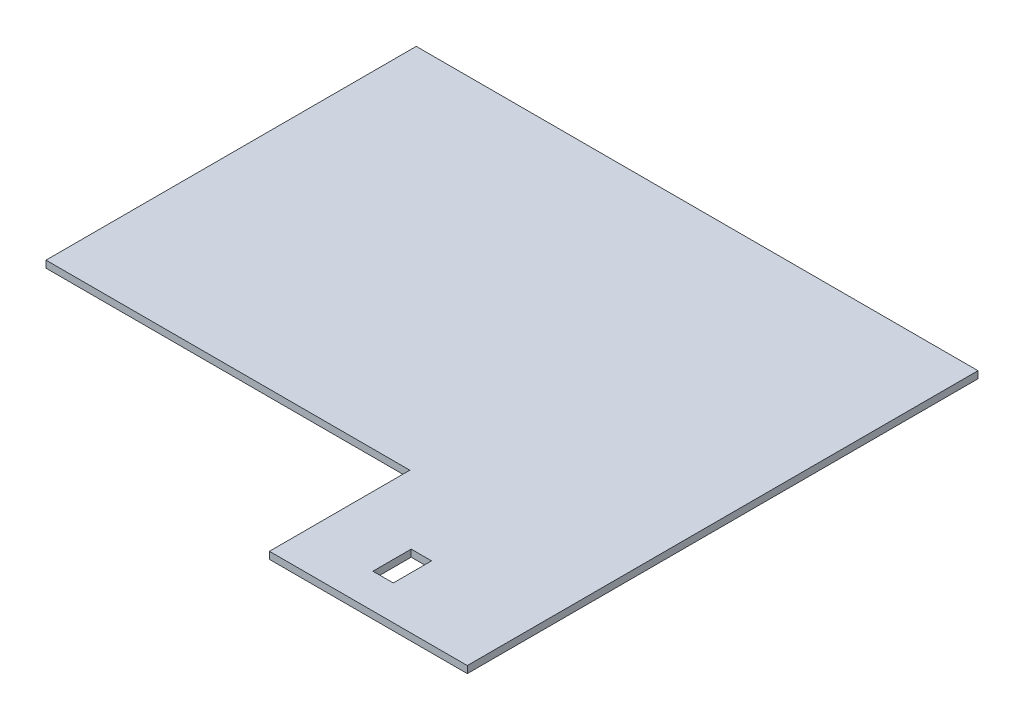
ISO-10303-21;
HEADER;
FILE_DESCRIPTION(('STEP AP214'),'2;1');
FILE_NAME('part.step','',(''),(''),'','','');
FILE_SCHEMA(('AUTOMOTIVE_DESIGN { 1 0 10303 214 1 1 1 1 }'));
ENDSEC;
DATA;
#1=APPLICATION_CONTEXT('core data for automotive mechanical design processes');
#2=APPLICATION_PROTOCOL_DEFINITION('international standard','automotive_design',2000,#1);
#3=PRODUCT_CONTEXT('',#1,'mechanical');
#4=PRODUCT('Part','Part','',(#3));
#5=PRODUCT_RELATED_PRODUCT_CATEGORY('part','',(#4));
#6=PRODUCT_DEFINITION_FORMATION('','',#4);
#7=PRODUCT_DEFINITION_CONTEXT('part definition',#1,'design');
#8=PRODUCT_DEFINITION('design','',#6,#7);
#9=PRODUCT_DEFINITION_SHAPE('','',#8);
#10=(LENGTH_UNIT() NAMED_UNIT(*) SI_UNIT(.MILLI.,.METRE.));
#11=(NAMED_UNIT(*) PLANE_ANGLE_UNIT() SI_UNIT($,.RADIAN.));
#12=(NAMED_UNIT(*) SI_UNIT($,.STERADIAN.) SOLID_ANGLE_UNIT());
#13=UNCERTAINTY_MEASURE_WITH_UNIT(LENGTH_MEASURE(1.E-05),#10,'distance_accuracy_value','');
#14=(GEOMETRIC_REPRESENTATION_CONTEXT(3) GLOBAL_UNCERTAINTY_ASSIGNED_CONTEXT((#13)) GLOBAL_UNIT_ASSIGNED_CONTEXT((#10,
#11,#12)) REPRESENTATION_CONTEXT('',''));
#15=CARTESIAN_POINT('',(0.,0.,0.));
#16=DIRECTION('',(0.,0.,1.));
#17=DIRECTION('',(1.,0.,0.));
#18=AXIS2_PLACEMENT_3D('',#15,#16,#17);
#19=CARTESIAN_POINT('',(127.62527392326,5.5,0.));
#20=DIRECTION('',(-1.,0.,0.));
#21=DIRECTION('',(0.,0.,1.));
#22=AXIS2_PLACEMENT_3D('',#19,#20,#21);
#23=PLANE('',#22);
#24=DIRECTION('',(0.,0.,-1.));
#25=VECTOR('',#24,1.);
#26=CARTESIAN_POINT('',(127.62527392326,0.,0.));
#27=LINE('',#26,#25);
#28=CARTESIAN_POINT('',(127.62527392326,0.,375.295789036028));
#29=VERTEX_POINT('',#28);
#30=CARTESIAN_POINT('',(127.62527392326,0.,345.295789036028));
#31=VERTEX_POINT('',#30);
#32=EDGE_CURVE('E156',#29,#31,#27,.T.);
#33=ORIENTED_EDGE('',*,*,#32,.T.);
#34=DIRECTION('',(0.,-1.,0.));
#35=VECTOR('',#34,1.);
#36=CARTESIAN_POINT('',(127.62527392326,5.5,345.295789036028));
#37=LINE('',#36,#35);
#38=CARTESIAN_POINT('',(127.62527392326,5.5,345.295789036028));
#39=VERTEX_POINT('',#38);
#40=EDGE_CURVE('E11',#39,#31,#37,.T.);
#41=ORIENTED_EDGE('',*,*,#40,.F.);
#42=DIRECTION('',(0.,0.,-1.));
#43=VECTOR('',#42,1.);
#44=CARTESIAN_POINT('',(127.62527392326,5.5,0.));
#45=LINE('',#44,#43);
#46=CARTESIAN_POINT('',(127.62527392326,5.5,375.295789036028));
#47=VERTEX_POINT('',#46);
#48=EDGE_CURVE('E126',#47,#39,#45,.T.);
#49=ORIENTED_EDGE('',*,*,#48,.F.);
#50=DIRECTION('',(0.,-1.,0.));
#51=VECTOR('',#50,1.);
#52=CARTESIAN_POINT('',(127.62527392326,5.5,375.295789036028));
#53=LINE('',#52,#51);
#54=EDGE_CURVE('E163',#47,#29,#53,.T.);
#55=ORIENTED_EDGE('',*,*,#54,.T.);
#56=EDGE_LOOP('',(#33,#41,#49,#55));
#57=FACE_BOUND('',#56,.T.);
#58=ADVANCED_FACE('F33',(#57),#23,.F.);
#59=CARTESIAN_POINT('',(0.,5.5,345.295789036028));
#60=DIRECTION('',(0.,0.,-1.));
#61=DIRECTION('',(-1.,0.,0.));
#62=AXIS2_PLACEMENT_3D('',#59,#60,#61);
#63=PLANE('',#62);
#64=DIRECTION('',(1.,0.,0.));
#65=VECTOR('',#64,1.);
#66=CARTESIAN_POINT('',(0.,0.,345.295789036028));
#67=LINE('',#66,#65);
#68=CARTESIAN_POINT('',(143.58670680185,0.,345.295789036028));
#69=VERTEX_POINT('',#68);
#70=EDGE_CURVE('E131',#31,#69,#67,.T.);
#71=ORIENTED_EDGE('',*,*,#70,.T.);
#72=DIRECTION('',(0.,-1.,0.));
#73=VECTOR('',#72,1.);
#74=CARTESIAN_POINT('',(143.58670680185,5.5,345.295789036028));
#75=LINE('',#74,#73);
#76=CARTESIAN_POINT('',(143.58670680185,5.5,345.295789036028));
#77=VERTEX_POINT('',#76);
#78=EDGE_CURVE('E43',#77,#69,#75,.T.);
#79=ORIENTED_EDGE('',*,*,#78,.F.);
#80=DIRECTION('',(1.,0.,0.));
#81=VECTOR('',#80,1.);
#82=CARTESIAN_POINT('',(0.,5.5,345.295789036028));
#83=LINE('',#82,#81);
#84=EDGE_CURVE('E120',#39,#77,#83,.T.);
#85=ORIENTED_EDGE('',*,*,#84,.F.);
#86=ORIENTED_EDGE('',*,*,#40,.T.);
#87=EDGE_LOOP('',(#71,#79,#85,#86));
#88=FACE_BOUND('',#87,.T.);
#89=ADVANCED_FACE('F130',(#88),#63,.F.);
#90=CARTESIAN_POINT('',(143.58670680185,5.5,0.));
#91=DIRECTION('',(1.,0.,0.));
#92=DIRECTION('',(0.,0.,-1.));
#93=AXIS2_PLACEMENT_3D('',#90,#91,#92);
#94=PLANE('',#93);
#95=DIRECTION('',(0.,0.,1.));
#96=VECTOR('',#95,1.);
#97=CARTESIAN_POINT('',(143.58670680185,0.,0.));
#98=LINE('',#97,#96);
#99=CARTESIAN_POINT('',(143.58670680185,0.,375.295789036028));
#100=VERTEX_POINT('',#99);
#101=EDGE_CURVE('E87',#69,#100,#98,.T.);
#102=ORIENTED_EDGE('',*,*,#101,.T.);
#103=DIRECTION('',(0.,-1.,0.));
#104=VECTOR('',#103,1.);
#105=CARTESIAN_POINT('',(143.58670680185,5.5,375.295789036028));
#106=LINE('',#105,#104);
#107=CARTESIAN_POINT('',(143.58670680185,5.5,375.295789036028));
#108=VERTEX_POINT('',#107);
#109=EDGE_CURVE('E132',#108,#100,#106,.T.);
#110=ORIENTED_EDGE('',*,*,#109,.F.);
#111=DIRECTION('',(0.,0.,1.));
#112=VECTOR('',#111,1.);
#113=CARTESIAN_POINT('',(143.58670680185,5.5,0.));
#114=LINE('',#113,#112);
#115=EDGE_CURVE('E124',#77,#108,#114,.T.);
#116=ORIENTED_EDGE('',*,*,#115,.F.);
#117=ORIENTED_EDGE('',*,*,#78,.T.);
#118=EDGE_LOOP('',(#102,#110,#116,#117));
#119=FACE_BOUND('',#118,.T.);
#120=ADVANCED_FACE('F134',(#119),#94,.F.);
#121=CARTESIAN_POINT('',(73.5867068018496,5.5,0.));
#122=DIRECTION('',(-1.,0.,0.));
#123=DIRECTION('',(0.,0.,1.));
#124=AXIS2_PLACEMENT_3D('',#121,#122,#123);
#125=PLANE('',#124);
#126=DIRECTION('',(0.,0.,-1.));
#127=VECTOR('',#126,1.);
#128=CARTESIAN_POINT('',(73.5867068018496,0.,0.));
#129=LINE('',#128,#127);
#130=CARTESIAN_POINT('',(73.5867068018496,0.,402.295789036028));
#131=VERTEX_POINT('',#130);
#132=CARTESIAN_POINT('',(73.5867068018496,0.,292.295789036028));
#133=VERTEX_POINT('',#132);
#134=EDGE_CURVE('E140',#131,#133,#129,.T.);
#135=ORIENTED_EDGE('',*,*,#134,.F.);
#136=DIRECTION('',(0.,-1.,0.));
#137=VECTOR('',#136,1.);
#138=CARTESIAN_POINT('',(73.5867068018496,5.5,402.295789036028));
#139=LINE('',#138,#137);
#140=CARTESIAN_POINT('',(73.5867068018496,5.5,402.295789036028));
#141=VERTEX_POINT('',#140);
#142=EDGE_CURVE('E37',#141,#131,#139,.T.);
#143=ORIENTED_EDGE('',*,*,#142,.F.);
#144=DIRECTION('',(0.,0.,-1.));
#145=VECTOR('',#144,1.);
#146=CARTESIAN_POINT('',(73.5867068018496,5.5,0.));
#147=LINE('',#146,#145);
#148=CARTESIAN_POINT('',(73.5867068018496,5.5,292.295789036028));
#149=VERTEX_POINT('',#148);
#150=EDGE_CURVE('E162',#141,#149,#147,.T.);
#151=ORIENTED_EDGE('',*,*,#150,.T.);
#152=DIRECTION('',(0.,-1.,0.));
#153=VECTOR('',#152,1.);
#154=CARTESIAN_POINT('',(73.5867068018496,5.5,292.295789036028));
#155=LINE('',#154,#153);
#156=EDGE_CURVE('E136',#149,#133,#155,.T.);
#157=ORIENTED_EDGE('',*,*,#156,.T.);
#158=EDGE_LOOP('',(#135,#143,#151,#157));
#159=FACE_BOUND('',#158,.T.);
#160=ADVANCED_FACE('F35',(#159),#125,.T.);
#161=CARTESIAN_POINT('',(0.,5.5,402.295789036028));
#162=DIRECTION('',(0.,0.,1.));
#163=DIRECTION('',(1.,0.,0.));
#164=AXIS2_PLACEMENT_3D('',#161,#162,#163);
#165=PLANE('',#164);
#166=DIRECTION('',(-1.,0.,0.));
#167=VECTOR('',#166,1.);
#168=CARTESIAN_POINT('',(0.,0.,402.295789036028));
#169=LINE('',#168,#167);
#170=CARTESIAN_POINT('',(228.58670680185,0.,402.295789036028));
#171=VERTEX_POINT('',#170);
#172=EDGE_CURVE('E143',#171,#131,#169,.T.);
#173=ORIENTED_EDGE('',*,*,#172,.F.);
#174=DIRECTION('',(0.,-1.,0.));
#175=VECTOR('',#174,1.);
#176=CARTESIAN_POINT('',(228.58670680185,5.5,402.295789036028));
#177=LINE('',#176,#175);
#178=CARTESIAN_POINT('',(228.58670680185,5.5,402.295789036028));
#179=VERTEX_POINT('',#178);
#180=EDGE_CURVE('E174',#179,#171,#177,.T.);
#181=ORIENTED_EDGE('',*,*,#180,.F.);
#182=DIRECTION('',(-1.,0.,0.));
#183=VECTOR('',#182,1.);
#184=CARTESIAN_POINT('',(0.,5.5,402.295789036028));
#185=LINE('',#184,#183);
#186=EDGE_CURVE('E183',#179,#141,#185,.T.);
#187=ORIENTED_EDGE('',*,*,#186,.T.);
#188=ORIENTED_EDGE('',*,*,#142,.T.);
#189=EDGE_LOOP('',(#173,#181,#187,#188));
#190=FACE_BOUND('',#189,.T.);
#191=ADVANCED_FACE('F181',(#190),#165,.T.);
#192=CARTESIAN_POINT('',(228.58670680185,5.5,0.));
#193=DIRECTION('',(1.,0.,0.));
#194=DIRECTION('',(0.,0.,-1.));
#195=AXIS2_PLACEMENT_3D('',#192,#193,#194);
#196=PLANE('',#195);
#197=DIRECTION('',(0.,0.,1.));
#198=VECTOR('',#197,1.);
#199=CARTESIAN_POINT('',(228.58670680185,0.,0.));
#200=LINE('',#199,#198);
#201=CARTESIAN_POINT('',(228.58670680185,0.,2.29578903602801));
#202=VERTEX_POINT('',#201);
#203=EDGE_CURVE('E146',#202,#171,#200,.T.);
#204=ORIENTED_EDGE('',*,*,#203,.F.);
#205=DIRECTION('',(0.,-1.,0.));
#206=VECTOR('',#205,1.);
#207=CARTESIAN_POINT('',(228.58670680185,5.5,2.29578903602801));
#208=LINE('',#207,#206);
#209=CARTESIAN_POINT('',(228.58670680185,5.5,2.29578903602801));
#210=VERTEX_POINT('',#209);
#211=EDGE_CURVE('E173',#210,#202,#208,.T.);
#212=ORIENTED_EDGE('',*,*,#211,.F.);
#213=DIRECTION('',(0.,0.,1.));
#214=VECTOR('',#213,1.);
#215=CARTESIAN_POINT('',(228.58670680185,5.5,0.));
#216=LINE('',#215,#214);
#217=EDGE_CURVE('E194',#210,#179,#216,.T.);
#218=ORIENTED_EDGE('',*,*,#217,.T.);
#219=ORIENTED_EDGE('',*,*,#180,.T.);
#220=EDGE_LOOP('',(#204,#212,#218,#219));
#221=FACE_BOUND('',#220,.T.);
#222=ADVANCED_FACE('F191',(#221),#196,.T.);
#223=CARTESIAN_POINT('',(0.,5.5,2.29578903602801));
#224=DIRECTION('',(0.,0.,1.));
#225=DIRECTION('',(1.,0.,0.));
#226=AXIS2_PLACEMENT_3D('',#223,#224,#225);
#227=PLANE('',#226);
#228=DIRECTION('',(-1.,0.,0.));
#229=VECTOR('',#228,1.);
#230=CARTESIAN_POINT('',(0.,0.,2.29578903602801));
#231=LINE('',#230,#229);
#232=CARTESIAN_POINT('',(-211.41329319815,0.,2.29578903602801));
#233=VERTEX_POINT('',#232);
#234=EDGE_CURVE('E149',#202,#233,#231,.T.);
#235=ORIENTED_EDGE('',*,*,#234,.T.);
#236=DIRECTION('',(0.,-1.,0.));
#237=VECTOR('',#236,1.);
#238=CARTESIAN_POINT('',(-211.41329319815,5.5,2.29578903602801));
#239=LINE('',#238,#237);
#240=CARTESIAN_POINT('',(-211.41329319815,5.5,2.29578903602801));
#241=VERTEX_POINT('',#240);
#242=EDGE_CURVE('E170',#241,#233,#239,.T.);
#243=ORIENTED_EDGE('',*,*,#242,.F.);
#244=DIRECTION('',(-1.,0.,0.));
#245=VECTOR('',#244,1.);
#246=CARTESIAN_POINT('',(0.,5.5,2.29578903602801));
#247=LINE('',#246,#245);
#248=EDGE_CURVE('E197',#210,#241,#247,.T.);
#249=ORIENTED_EDGE('',*,*,#248,.F.);
#250=ORIENTED_EDGE('',*,*,#211,.T.);
#251=EDGE_LOOP('',(#235,#243,#249,#250));
#252=FACE_BOUND('',#251,.T.);
#253=ADVANCED_FACE('F198',(#252),#227,.F.);
#254=CARTESIAN_POINT('',(-211.41329319815,5.5,0.));
#255=DIRECTION('',(1.,0.,0.));
#256=DIRECTION('',(0.,0.,-1.));
#257=AXIS2_PLACEMENT_3D('',#254,#255,#256);
#258=PLANE('',#257);
#259=DIRECTION('',(0.,0.,1.));
#260=VECTOR('',#259,1.);
#261=CARTESIAN_POINT('',(-211.41329319815,0.,0.));
#262=LINE('',#261,#260);
#263=CARTESIAN_POINT('',(-211.41329319815,0.,292.295789036028));
#264=VERTEX_POINT('',#263);
#265=EDGE_CURVE('E151',#233,#264,#262,.T.);
#266=ORIENTED_EDGE('',*,*,#265,.T.);
#267=DIRECTION('',(0.,-1.,0.));
#268=VECTOR('',#267,1.);
#269=CARTESIAN_POINT('',(-211.41329319815,5.5,292.295789036028));
#270=LINE('',#269,#268);
#271=CARTESIAN_POINT('',(-211.41329319815,5.5,292.295789036028));
#272=VERTEX_POINT('',#271);
#273=EDGE_CURVE('E167',#272,#264,#270,.T.);
#274=ORIENTED_EDGE('',*,*,#273,.F.);
#275=DIRECTION('',(0.,0.,1.));
#276=VECTOR('',#275,1.);
#277=CARTESIAN_POINT('',(-211.41329319815,5.5,0.));
#278=LINE('',#277,#276);
#279=EDGE_CURVE('E201',#241,#272,#278,.T.);
#280=ORIENTED_EDGE('',*,*,#279,.F.);
#281=ORIENTED_EDGE('',*,*,#242,.T.);
#282=EDGE_LOOP('',(#266,#274,#280,#281));
#283=FACE_BOUND('',#282,.T.);
#284=ADVANCED_FACE('F214',(#283),#258,.F.);
#285=CARTESIAN_POINT('',(-1.13864391224132E-13,5.5,292.295789036028));
#286=DIRECTION('',(0.,0.,-1.));
#287=DIRECTION('',(-1.,0.,0.));
#288=AXIS2_PLACEMENT_3D('',#285,#286,#287);
#289=PLANE('',#288);
#290=DIRECTION('',(1.,0.,0.));
#291=VECTOR('',#290,1.);
#292=CARTESIAN_POINT('',(-1.13864391224132E-13,0.,292.295789036028));
#293=LINE('',#292,#291);
#294=EDGE_CURVE('E153',#264,#133,#293,.T.);
#295=ORIENTED_EDGE('',*,*,#294,.T.);
#296=ORIENTED_EDGE('',*,*,#156,.F.);
#297=DIRECTION('',(1.,0.,0.));
#298=VECTOR('',#297,1.);
#299=CARTESIAN_POINT('',(-1.13864391224132E-13,5.5,292.295789036028));
#300=LINE('',#299,#298);
#301=EDGE_CURVE('E208',#272,#149,#300,.T.);
#302=ORIENTED_EDGE('',*,*,#301,.F.);
#303=ORIENTED_EDGE('',*,*,#273,.T.);
#304=EDGE_LOOP('',(#295,#296,#302,#303));
#305=FACE_BOUND('',#304,.T.);
#306=ADVANCED_FACE('F212',(#305),#289,.F.);
#307=CARTESIAN_POINT('',(0.,5.5,375.295789036028));
#308=DIRECTION('',(0.,0.,1.));
#309=DIRECTION('',(1.,0.,0.));
#310=AXIS2_PLACEMENT_3D('',#307,#308,#309);
#311=PLANE('',#310);
#312=DIRECTION('',(-1.,0.,0.));
#313=VECTOR('',#312,1.);
#314=CARTESIAN_POINT('',(0.,0.,375.295789036028));
#315=LINE('',#314,#313);
#316=EDGE_CURVE('E93',#100,#29,#315,.T.);
#317=ORIENTED_EDGE('',*,*,#316,.T.);
#318=ORIENTED_EDGE('',*,*,#54,.F.);
#319=DIRECTION('',(-1.,0.,0.));
#320=VECTOR('',#319,1.);
#321=CARTESIAN_POINT('',(0.,5.5,375.295789036028));
#322=LINE('',#321,#320);
#323=EDGE_CURVE('E52',#108,#47,#322,.T.);
#324=ORIENTED_EDGE('',*,*,#323,.F.);
#325=ORIENTED_EDGE('',*,*,#109,.T.);
#326=EDGE_LOOP('',(#317,#318,#324,#325));
#327=FACE_BOUND('',#326,.T.);
#328=ADVANCED_FACE('F221',(#327),#311,.F.);
#329=CARTESIAN_POINT('',(0.,5.5,0.));
#330=DIRECTION('',(0.,1.,0.));
#331=DIRECTION('',(0.,0.,1.));
#332=AXIS2_PLACEMENT_3D('',#329,#330,#331);
#333=PLANE('',#332);
#334=ORIENTED_EDGE('',*,*,#150,.F.);
#335=ORIENTED_EDGE('',*,*,#186,.F.);
#336=ORIENTED_EDGE('',*,*,#217,.F.);
#337=ORIENTED_EDGE('',*,*,#248,.T.);
#338=ORIENTED_EDGE('',*,*,#279,.T.);
#339=ORIENTED_EDGE('',*,*,#301,.T.);
#340=EDGE_LOOP('',(#334,#335,#336,#337,#338,#339));
#341=FACE_BOUND('',#340,.T.);
#342=ORIENTED_EDGE('',*,*,#48,.T.);
#343=ORIENTED_EDGE('',*,*,#84,.T.);
#344=ORIENTED_EDGE('',*,*,#115,.T.);
#345=ORIENTED_EDGE('',*,*,#323,.T.);
#346=EDGE_LOOP('',(#342,#343,#344,#345));
#347=FACE_BOUND('',#346,.T.);
#348=ADVANCED_FACE('F122',(#341,#347),#333,.T.);
#349=CARTESIAN_POINT('',(0.,0.,0.));
#350=DIRECTION('',(0.,1.,0.));
#351=DIRECTION('',(0.,0.,1.));
#352=AXIS2_PLACEMENT_3D('',#349,#350,#351);
#353=PLANE('',#352);
#354=ORIENTED_EDGE('',*,*,#134,.T.);
#355=ORIENTED_EDGE('',*,*,#294,.F.);
#356=ORIENTED_EDGE('',*,*,#265,.F.);
#357=ORIENTED_EDGE('',*,*,#234,.F.);
#358=ORIENTED_EDGE('',*,*,#203,.T.);
#359=ORIENTED_EDGE('',*,*,#172,.T.);
#360=EDGE_LOOP('',(#354,#355,#356,#357,#358,#359));
#361=FACE_BOUND('',#360,.T.);
#362=ORIENTED_EDGE('',*,*,#32,.F.);
#363=ORIENTED_EDGE('',*,*,#316,.F.);
#364=ORIENTED_EDGE('',*,*,#101,.F.);
#365=ORIENTED_EDGE('',*,*,#70,.F.);
#366=EDGE_LOOP('',(#362,#363,#364,#365));
#367=FACE_BOUND('',#366,.T.);
#368=ADVANCED_FACE('F187',(#361,#367),#353,.F.);
#369=CLOSED_SHELL('',(#58,#89,#120,#160,#191,#222,#253,#284,#306,#328,#348,#368));
#370=MANIFOLD_SOLID_BREP('B2',#369);
#371=ADVANCED_BREP_SHAPE_REPRESENTATION('',(#18,#370),#14);
#372=SHAPE_DEFINITION_REPRESENTATION(#9,#371);
ENDSEC;
END-ISO-10303-21;
